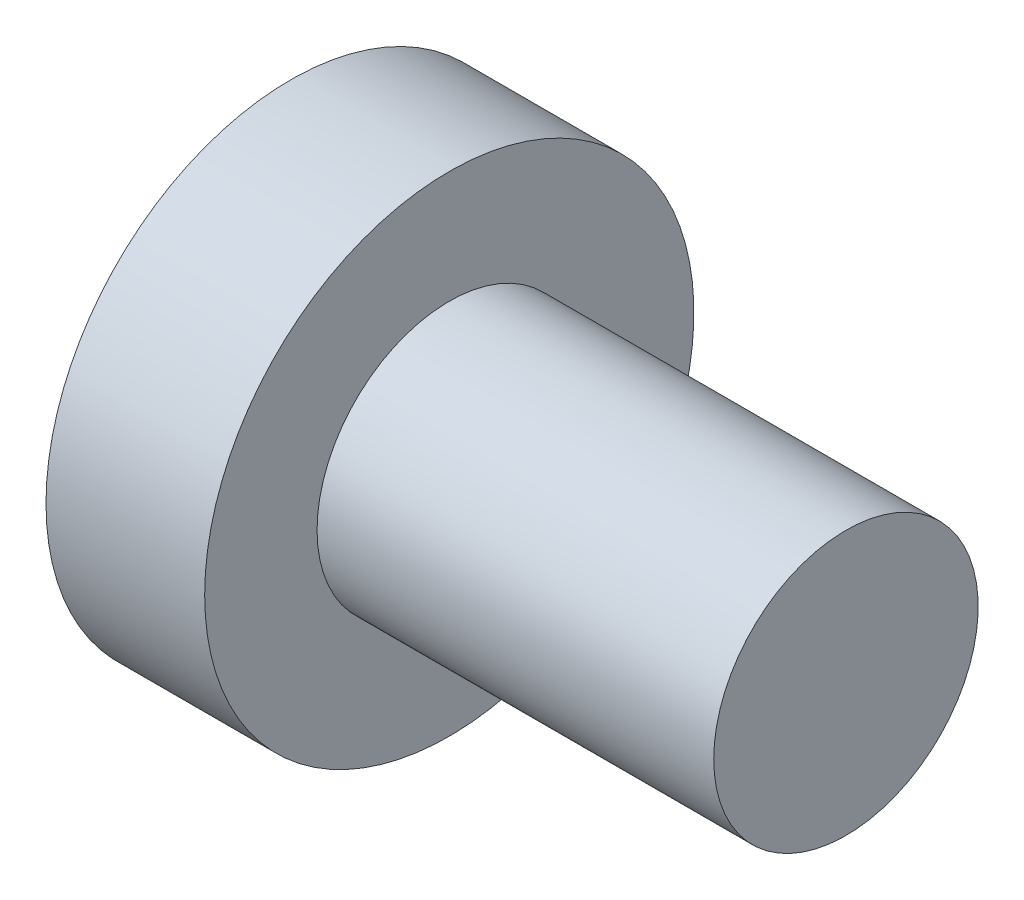
ISO-10303-21;
HEADER;
FILE_DESCRIPTION(('STEP AP214'),'2;1');
FILE_NAME('part.step','',(''),(''),'','','');
FILE_SCHEMA(('AUTOMOTIVE_DESIGN { 1 0 10303 214 1 1 1 1 }'));
ENDSEC;
DATA;
#1=APPLICATION_CONTEXT('core data for automotive mechanical design processes');
#2=APPLICATION_PROTOCOL_DEFINITION('international standard','automotive_design',2000,#1);
#3=PRODUCT_CONTEXT('',#1,'mechanical');
#4=PRODUCT('Part','Part','',(#3));
#5=PRODUCT_RELATED_PRODUCT_CATEGORY('part','',(#4));
#6=PRODUCT_DEFINITION_FORMATION('','',#4);
#7=PRODUCT_DEFINITION_CONTEXT('part definition',#1,'design');
#8=PRODUCT_DEFINITION('design','',#6,#7);
#9=PRODUCT_DEFINITION_SHAPE('','',#8);
#10=(LENGTH_UNIT() NAMED_UNIT(*) SI_UNIT(.MILLI.,.METRE.));
#11=(NAMED_UNIT(*) PLANE_ANGLE_UNIT() SI_UNIT($,.RADIAN.));
#12=(NAMED_UNIT(*) SI_UNIT($,.STERADIAN.) SOLID_ANGLE_UNIT());
#13=UNCERTAINTY_MEASURE_WITH_UNIT(LENGTH_MEASURE(1.E-05),#10,'distance_accuracy_value','');
#14=(GEOMETRIC_REPRESENTATION_CONTEXT(3) GLOBAL_UNCERTAINTY_ASSIGNED_CONTEXT((#13)) GLOBAL_UNIT_ASSIGNED_CONTEXT((#10,
#11,#12)) REPRESENTATION_CONTEXT('',''));
#15=CARTESIAN_POINT('',(0.,0.,0.));
#16=DIRECTION('',(0.,0.,1.));
#17=DIRECTION('',(1.,0.,0.));
#18=AXIS2_PLACEMENT_3D('',#15,#16,#17);
#19=CARTESIAN_POINT('',(-6.,0.,0.));
#20=DIRECTION('',(1.,0.,0.));
#21=DIRECTION('',(0.,0.,-1.));
#22=AXIS2_PLACEMENT_3D('',#19,#20,#21);
#23=PLANE('',#22);
#24=CARTESIAN_POINT('',(-6.,0.,0.));
#25=DIRECTION('',(-1.,0.,0.));
#26=DIRECTION('',(0.,0.,1.));
#27=AXIS2_PLACEMENT_3D('',#24,#25,#26);
#28=CIRCLE('',#27,9.25);
#29=CARTESIAN_POINT('',(-6.,0.,9.25));
#30=VERTEX_POINT('',#29);
#31=EDGE_CURVE('E10',#30,#30,#28,.T.);
#32=ORIENTED_EDGE('',*,*,#31,.T.);
#33=EDGE_LOOP('',(#32));
#34=FACE_BOUND('',#33,.T.);
#35=ADVANCED_FACE('F39',(#34),#23,.F.);
#36=CARTESIAN_POINT('',(0.,0.,0.));
#37=DIRECTION('',(-1.,0.,0.));
#38=DIRECTION('',(0.,0.,1.));
#39=AXIS2_PLACEMENT_3D('',#36,#37,#38);
#40=CYLINDRICAL_SURFACE('',#39,9.25);
#41=ORIENTED_EDGE('',*,*,#31,.F.);
#42=EDGE_LOOP('',(#41));
#43=FACE_BOUND('',#42,.T.);
#44=CARTESIAN_POINT('',(0.,0.,0.));
#45=DIRECTION('',(-1.,0.,0.));
#46=DIRECTION('',(0.,0.,1.));
#47=AXIS2_PLACEMENT_3D('',#44,#45,#46);
#48=CIRCLE('',#47,9.25);
#49=CARTESIAN_POINT('',(0.,0.,9.25));
#50=VERTEX_POINT('',#49);
#51=EDGE_CURVE('E45',#50,#50,#48,.T.);
#52=ORIENTED_EDGE('',*,*,#51,.T.);
#53=EDGE_LOOP('',(#52));
#54=FACE_BOUND('',#53,.T.);
#55=ADVANCED_FACE('F71',(#43,#54),#40,.T.);
#56=CARTESIAN_POINT('',(0.,9.25,0.));
#57=DIRECTION('',(-1.,0.,0.));
#58=DIRECTION('',(0.,0.,1.));
#59=AXIS2_PLACEMENT_3D('',#56,#57,#58);
#60=PLANE('',#59);
#61=ORIENTED_EDGE('',*,*,#51,.F.);
#62=EDGE_LOOP('',(#61));
#63=FACE_BOUND('',#62,.T.);
#64=CARTESIAN_POINT('',(0.,0.,0.));
#65=DIRECTION('',(-1.,0.,0.));
#66=DIRECTION('',(0.,0.,1.));
#67=AXIS2_PLACEMENT_3D('',#64,#65,#66);
#68=CIRCLE('',#67,5.);
#69=CARTESIAN_POINT('',(0.,0.,5.));
#70=VERTEX_POINT('',#69);
#71=EDGE_CURVE('E49',#70,#70,#68,.T.);
#72=ORIENTED_EDGE('',*,*,#71,.T.);
#73=EDGE_LOOP('',(#72));
#74=FACE_BOUND('',#73,.T.);
#75=ADVANCED_FACE('F67',(#63,#74),#60,.F.);
#76=CARTESIAN_POINT('',(0.,0.,0.));
#77=DIRECTION('',(-1.,0.,0.));
#78=DIRECTION('',(0.,0.,1.));
#79=AXIS2_PLACEMENT_3D('',#76,#77,#78);
#80=CYLINDRICAL_SURFACE('',#79,5.);
#81=ORIENTED_EDGE('',*,*,#71,.F.);
#82=EDGE_LOOP('',(#81));
#83=FACE_BOUND('',#82,.T.);
#84=CARTESIAN_POINT('',(15.,0.,0.));
#85=DIRECTION('',(-1.,0.,0.));
#86=DIRECTION('',(0.,0.,1.));
#87=AXIS2_PLACEMENT_3D('',#84,#85,#86);
#88=CIRCLE('',#87,5.);
#89=CARTESIAN_POINT('',(15.,0.,5.));
#90=VERTEX_POINT('',#89);
#91=EDGE_CURVE('E53',#90,#90,#88,.T.);
#92=ORIENTED_EDGE('',*,*,#91,.T.);
#93=EDGE_LOOP('',(#92));
#94=FACE_BOUND('',#93,.T.);
#95=ADVANCED_FACE('F59',(#83,#94),#80,.T.);
#96=CARTESIAN_POINT('',(15.,5.,0.));
#97=DIRECTION('',(-1.,0.,0.));
#98=DIRECTION('',(0.,0.,1.));
#99=AXIS2_PLACEMENT_3D('',#96,#97,#98);
#100=PLANE('',#99);
#101=ORIENTED_EDGE('',*,*,#91,.F.);
#102=EDGE_LOOP('',(#101));
#103=FACE_BOUND('',#102,.T.);
#104=ADVANCED_FACE('F61',(#103),#100,.F.);
#105=CLOSED_SHELL('',(#35,#55,#75,#95,#104));
#106=MANIFOLD_SOLID_BREP('B2',#105);
#107=ADVANCED_BREP_SHAPE_REPRESENTATION('',(#18,#106),#14);
#108=SHAPE_DEFINITION_REPRESENTATION(#9,#107);
ENDSEC;
END-ISO-10303-21;
